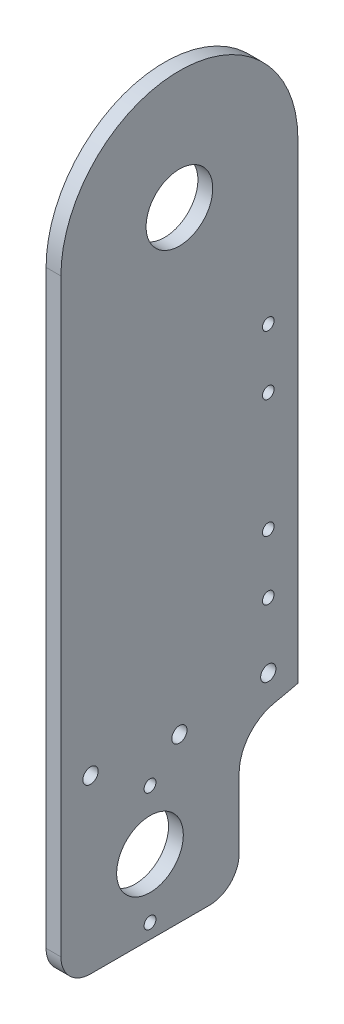
ISO-10303-21;
HEADER;
FILE_DESCRIPTION(('STEP AP214'),'2;1');
FILE_NAME('part.step','',(''),(''),'','','');
FILE_SCHEMA(('AUTOMOTIVE_DESIGN { 1 0 10303 214 1 1 1 1 }'));
ENDSEC;
DATA;
#1=APPLICATION_CONTEXT('core data for automotive mechanical design processes');
#2=APPLICATION_PROTOCOL_DEFINITION('international standard','automotive_design',2000,#1);
#3=PRODUCT_CONTEXT('',#1,'mechanical');
#4=PRODUCT('Part','Part','',(#3));
#5=PRODUCT_RELATED_PRODUCT_CATEGORY('part','',(#4));
#6=PRODUCT_DEFINITION_FORMATION('','',#4);
#7=PRODUCT_DEFINITION_CONTEXT('part definition',#1,'design');
#8=PRODUCT_DEFINITION('design','',#6,#7);
#9=PRODUCT_DEFINITION_SHAPE('','',#8);
#10=(LENGTH_UNIT() NAMED_UNIT(*) SI_UNIT(.MILLI.,.METRE.));
#11=(NAMED_UNIT(*) PLANE_ANGLE_UNIT() SI_UNIT($,.RADIAN.));
#12=(NAMED_UNIT(*) SI_UNIT($,.STERADIAN.) SOLID_ANGLE_UNIT());
#13=UNCERTAINTY_MEASURE_WITH_UNIT(LENGTH_MEASURE(1.E-05),#10,'distance_accuracy_value','');
#14=(GEOMETRIC_REPRESENTATION_CONTEXT(3) GLOBAL_UNCERTAINTY_ASSIGNED_CONTEXT((#13)) GLOBAL_UNIT_ASSIGNED_CONTEXT((#10,
#11,#12)) REPRESENTATION_CONTEXT('',''));
#15=CARTESIAN_POINT('',(0.,0.,0.));
#16=DIRECTION('',(0.,0.,1.));
#17=DIRECTION('',(1.,0.,0.));
#18=AXIS2_PLACEMENT_3D('',#15,#16,#17);
#19=CARTESIAN_POINT('',(6.35,0.,0.));
#20=DIRECTION('',(-1.,0.,0.));
#21=DIRECTION('',(0.,0.,1.));
#22=AXIS2_PLACEMENT_3D('',#19,#20,#21);
#23=PLANE('',#22);
#24=CARTESIAN_POINT('',(6.35,-138.489896777042,-38.1));
#25=DIRECTION('',(1.,0.,0.));
#26=DIRECTION('',(0.,0.,-1.));
#27=AXIS2_PLACEMENT_3D('',#24,#25,#26);
#28=CIRCLE('',#27,2.4892);
#29=CARTESIAN_POINT('',(6.35,-138.489896777042,-40.5892));
#30=VERTEX_POINT('',#29);
#31=EDGE_CURVE('E319',#30,#30,#28,.T.);
#32=ORIENTED_EDGE('',*,*,#31,.F.);
#33=EDGE_LOOP('',(#32));
#34=FACE_BOUND('',#33,.T.);
#35=CARTESIAN_POINT('',(6.35,-87.6898967770419,-38.1));
#36=DIRECTION('',(1.,0.,0.));
#37=DIRECTION('',(0.,0.,-1.));
#38=AXIS2_PLACEMENT_3D('',#35,#36,#37);
#39=CIRCLE('',#38,2.48919999999998);
#40=CARTESIAN_POINT('',(6.35,-87.6898967770419,-40.5892));
#41=VERTEX_POINT('',#40);
#42=EDGE_CURVE('E307',#41,#41,#39,.T.);
#43=ORIENTED_EDGE('',*,*,#42,.F.);
#44=EDGE_LOOP('',(#43));
#45=FACE_BOUND('',#44,.T.);
#46=CARTESIAN_POINT('',(6.35,-62.2898967770419,-38.1));
#47=DIRECTION('',(1.,0.,0.));
#48=DIRECTION('',(0.,0.,-1.));
#49=AXIS2_PLACEMENT_3D('',#46,#47,#48);
#50=CIRCLE('',#49,2.48919999999999);
#51=CARTESIAN_POINT('',(6.35,-62.2898967770419,-40.5892));
#52=VERTEX_POINT('',#51);
#53=EDGE_CURVE('E295',#52,#52,#50,.T.);
#54=ORIENTED_EDGE('',*,*,#53,.F.);
#55=EDGE_LOOP('',(#54));
#56=FACE_BOUND('',#55,.T.);
#57=CARTESIAN_POINT('',(6.35,-259.139896777041,12.6030145186586));
#58=DIRECTION('',(1.,0.,0.));
#59=DIRECTION('',(0.,0.,-1.));
#60=AXIS2_PLACEMENT_3D('',#57,#58,#59);
#61=CIRCLE('',#60,2.53999999999999);
#62=CARTESIAN_POINT('',(6.35,-259.139896777041,10.0630145186586));
#63=VERTEX_POINT('',#62);
#64=EDGE_CURVE('E287',#63,#63,#61,.T.);
#65=ORIENTED_EDGE('',*,*,#64,.F.);
#66=EDGE_LOOP('',(#65));
#67=FACE_BOUND('',#66,.T.);
#68=CARTESIAN_POINT('',(6.35,-208.339896777041,12.6030145186586));
#69=DIRECTION('',(1.,0.,0.));
#70=DIRECTION('',(0.,0.,-1.));
#71=AXIS2_PLACEMENT_3D('',#68,#69,#70);
#72=CIRCLE('',#71,2.53999999999999);
#73=CARTESIAN_POINT('',(6.35,-208.339896777041,10.0630145186586));
#74=VERTEX_POINT('',#73);
#75=EDGE_CURVE('E279',#74,#74,#72,.T.);
#76=ORIENTED_EDGE('',*,*,#75,.F.);
#77=EDGE_LOOP('',(#76));
#78=FACE_BOUND('',#77,.T.);
#79=CARTESIAN_POINT('',(6.35,-191.833069099152,-38.1000000000002));
#80=DIRECTION('',(1.,0.,0.));
#81=DIRECTION('',(0.,0.,-1.));
#82=AXIS2_PLACEMENT_3D('',#79,#80,#81);
#83=CIRCLE('',#82,3.26389999999999);
#84=CARTESIAN_POINT('',(6.35,-191.833069099152,-41.3639000000001));
#85=VERTEX_POINT('',#84);
#86=EDGE_CURVE('E271',#85,#85,#83,.T.);
#87=ORIENTED_EDGE('',*,*,#86,.F.);
#88=EDGE_LOOP('',(#87));
#89=FACE_BOUND('',#88,.T.);
#90=CARTESIAN_POINT('',(6.35,-195.58,1.36443570224712E-12));
#91=DIRECTION('',(1.,0.,0.));
#92=DIRECTION('',(0.,0.,-1.));
#93=AXIS2_PLACEMENT_3D('',#90,#91,#92);
#94=CIRCLE('',#93,3.26389999999999);
#95=CARTESIAN_POINT('',(6.35,-195.58,-3.26389999999862));
#96=VERTEX_POINT('',#95);
#97=EDGE_CURVE('E263',#96,#96,#94,.T.);
#98=ORIENTED_EDGE('',*,*,#97,.F.);
#99=EDGE_LOOP('',(#98));
#100=FACE_BOUND('',#99,.T.);
#101=CARTESIAN_POINT('',(6.35,-191.833069099151,38.1000000000027));
#102=DIRECTION('',(1.,0.,0.));
#103=DIRECTION('',(0.,0.,-1.));
#104=AXIS2_PLACEMENT_3D('',#101,#102,#103);
#105=CIRCLE('',#104,3.26389999999999);
#106=CARTESIAN_POINT('',(6.35,-191.833069099151,34.8361000000027));
#107=VERTEX_POINT('',#106);
#108=EDGE_CURVE('E255',#107,#107,#105,.T.);
#109=ORIENTED_EDGE('',*,*,#108,.F.);
#110=EDGE_LOOP('',(#109));
#111=FACE_BOUND('',#110,.T.);
#112=DIRECTION('',(0.,0.,-1.));
#113=VECTOR('',#112,1.);
#114=CARTESIAN_POINT('',(6.35,-265.489896777041,50.8000000000028));
#115=LINE('',#114,#113);
#116=CARTESIAN_POINT('',(6.35,-265.489896777041,38.1000000000034));
#117=VERTEX_POINT('',#116);
#118=CARTESIAN_POINT('',(6.35,-265.489896777041,-12.8939709626856));
#119=VERTEX_POINT('',#118);
#120=EDGE_CURVE('E128',#117,#119,#115,.T.);
#121=ORIENTED_EDGE('',*,*,#120,.T.);
#122=CARTESIAN_POINT('',(6.35,-252.789896777041,-12.8939709626856));
#123=DIRECTION('',(-1.,0.,0.));
#124=DIRECTION('',(0.,0.,1.));
#125=AXIS2_PLACEMENT_3D('',#122,#123,#124);
#126=CIRCLE('',#125,12.7);
#127=CARTESIAN_POINT('',(6.35,-252.789896777041,-25.5939709626856));
#128=VERTEX_POINT('',#127);
#129=EDGE_CURVE('E174',#119,#128,#126,.F.);
#130=ORIENTED_EDGE('',*,*,#129,.T.);
#131=DIRECTION('',(0.,1.,0.));
#132=VECTOR('',#131,1.);
#133=CARTESIAN_POINT('',(6.35,-265.489896777041,-25.5939709626856));
#134=LINE('',#133,#132);
#135=CARTESIAN_POINT('',(6.35,-222.903218363224,-25.5939709626855));
#136=VERTEX_POINT('',#135);
#137=EDGE_CURVE('E210',#128,#136,#134,.T.);
#138=ORIENTED_EDGE('',*,*,#137,.T.);
#139=CARTESIAN_POINT('',(6.35,-222.903218363224,-44.6439709626855));
#140=DIRECTION('',(-1.,0.,0.));
#141=DIRECTION('',(0.,0.,1.));
#142=AXIS2_PLACEMENT_3D('',#139,#140,#141);
#143=CIRCLE('',#142,19.05);
#144=CARTESIAN_POINT('',(6.35,-204.224177718261,-40.9028560775443));
#145=VERTEX_POINT('',#144);
#146=EDGE_CURVE('E11',#136,#145,#143,.T.);
#147=ORIENTED_EDGE('',*,*,#146,.T.);
#148=CARTESIAN_POINT('',(6.35,0.,0.));
#149=DIRECTION('',(1.,0.,0.));
#150=DIRECTION('',(0.,0.,-1.));
#151=AXIS2_PLACEMENT_3D('',#148,#149,#150);
#152=CIRCLE('',#151,208.28);
#153=CARTESIAN_POINT('',(6.35,-201.989896777042,-50.8));
#154=VERTEX_POINT('',#153);
#155=EDGE_CURVE('E191',#145,#154,#152,.T.);
#156=ORIENTED_EDGE('',*,*,#155,.T.);
#157=DIRECTION('',(0.,1.,0.));
#158=VECTOR('',#157,1.);
#159=CARTESIAN_POINT('',(6.35,0.,-50.8));
#160=LINE('',#159,#158);
#161=CARTESIAN_POINT('',(6.35,0.,-50.8));
#162=VERTEX_POINT('',#161);
#163=EDGE_CURVE('E135',#154,#162,#160,.T.);
#164=ORIENTED_EDGE('',*,*,#163,.T.);
#165=CARTESIAN_POINT('',(6.35,0.,0.));
#166=DIRECTION('',(1.,0.,0.));
#167=DIRECTION('',(0.,0.,1.));
#168=AXIS2_PLACEMENT_3D('',#165,#166,#167);
#169=CIRCLE('',#168,50.8);
#170=CARTESIAN_POINT('',(6.35,0.,50.8));
#171=VERTEX_POINT('',#170);
#172=EDGE_CURVE('E129',#162,#171,#169,.T.);
#173=ORIENTED_EDGE('',*,*,#172,.T.);
#174=DIRECTION('',(0.,-1.,0.));
#175=VECTOR('',#174,1.);
#176=CARTESIAN_POINT('',(6.35,0.,50.8));
#177=LINE('',#176,#175);
#178=CARTESIAN_POINT('',(6.35,-252.789896777042,50.8000000000071));
#179=VERTEX_POINT('',#178);
#180=EDGE_CURVE('E116',#171,#179,#177,.T.);
#181=ORIENTED_EDGE('',*,*,#180,.T.);
#182=CARTESIAN_POINT('',(6.35,-252.789896777041,38.1000000000034));
#183=DIRECTION('',(-1.,0.,0.));
#184=DIRECTION('',(0.,0.,1.));
#185=AXIS2_PLACEMENT_3D('',#182,#183,#184);
#186=CIRCLE('',#185,12.7);
#187=EDGE_CURVE('E171',#179,#117,#186,.F.);
#188=ORIENTED_EDGE('',*,*,#187,.T.);
#189=EDGE_LOOP('',(#121,#130,#138,#147,#156,#164,#173,#181,#188));
#190=FACE_BOUND('',#189,.T.);
#191=CARTESIAN_POINT('',(6.35,0.,0.));
#192=DIRECTION('',(1.,0.,0.));
#193=DIRECTION('',(0.,0.,-1.));
#194=AXIS2_PLACEMENT_3D('',#191,#192,#193);
#195=CIRCLE('',#194,14.2875);
#196=CARTESIAN_POINT('',(6.35,0.,-14.2875));
#197=VERTEX_POINT('',#196);
#198=EDGE_CURVE('E217',#197,#197,#195,.T.);
#199=ORIENTED_EDGE('',*,*,#198,.F.);
#200=EDGE_LOOP('',(#199));
#201=FACE_BOUND('',#200,.T.);
#202=CARTESIAN_POINT('',(6.35,-233.739896777041,12.6030145186586));
#203=DIRECTION('',(1.,0.,0.));
#204=DIRECTION('',(0.,0.,-1.));
#205=AXIS2_PLACEMENT_3D('',#202,#203,#204);
#206=CIRCLE('',#205,14.2875);
#207=CARTESIAN_POINT('',(6.35,-233.739896777041,-1.68448548134139));
#208=VERTEX_POINT('',#207);
#209=EDGE_CURVE('E240',#208,#208,#206,.T.);
#210=ORIENTED_EDGE('',*,*,#209,.F.);
#211=EDGE_LOOP('',(#210));
#212=FACE_BOUND('',#211,.T.);
#213=CARTESIAN_POINT('',(6.35,-163.889896777042,-38.1));
#214=DIRECTION('',(1.,0.,0.));
#215=DIRECTION('',(0.,0.,-1.));
#216=AXIS2_PLACEMENT_3D('',#213,#214,#215);
#217=CIRCLE('',#216,2.4892);
#218=CARTESIAN_POINT('',(6.35,-163.889896777042,-40.5892));
#219=VERTEX_POINT('',#218);
#220=EDGE_CURVE('E331',#219,#219,#217,.T.);
#221=ORIENTED_EDGE('',*,*,#220,.F.);
#222=EDGE_LOOP('',(#221));
#223=FACE_BOUND('',#222,.T.);
#224=ADVANCED_FACE('F44',(#34,#45,#56,#67,#78,#89,#100,#111,#190,#201,#212,#223),#23,.F.);
#225=CARTESIAN_POINT('',(0.,0.,0.));
#226=DIRECTION('',(-1.,0.,0.));
#227=DIRECTION('',(0.,0.,1.));
#228=AXIS2_PLACEMENT_3D('',#225,#226,#227);
#229=PLANE('',#228);
#230=CARTESIAN_POINT('',(0.,-163.889896777042,-38.1));
#231=DIRECTION('',(1.,0.,0.));
#232=DIRECTION('',(0.,0.,-1.));
#233=AXIS2_PLACEMENT_3D('',#230,#231,#232);
#234=CIRCLE('',#233,4.7625);
#235=CARTESIAN_POINT('',(0.,-163.889896777042,-42.8625));
#236=VERTEX_POINT('',#235);
#237=EDGE_CURVE('E335',#236,#236,#234,.T.);
#238=ORIENTED_EDGE('',*,*,#237,.T.);
#239=EDGE_LOOP('',(#238));
#240=FACE_BOUND('',#239,.T.);
#241=CARTESIAN_POINT('',(0.,-138.489896777042,-38.1));
#242=DIRECTION('',(1.,0.,0.));
#243=DIRECTION('',(0.,0.,-1.));
#244=AXIS2_PLACEMENT_3D('',#241,#242,#243);
#245=CIRCLE('',#244,4.7625);
#246=CARTESIAN_POINT('',(0.,-138.489896777042,-42.8625));
#247=VERTEX_POINT('',#246);
#248=EDGE_CURVE('E323',#247,#247,#245,.T.);
#249=ORIENTED_EDGE('',*,*,#248,.T.);
#250=EDGE_LOOP('',(#249));
#251=FACE_BOUND('',#250,.T.);
#252=CARTESIAN_POINT('',(0.,-87.6898967770419,-38.1));
#253=DIRECTION('',(1.,0.,0.));
#254=DIRECTION('',(0.,0.,-1.));
#255=AXIS2_PLACEMENT_3D('',#252,#253,#254);
#256=CIRCLE('',#255,4.7625);
#257=CARTESIAN_POINT('',(0.,-87.6898967770419,-42.8625));
#258=VERTEX_POINT('',#257);
#259=EDGE_CURVE('E311',#258,#258,#256,.T.);
#260=ORIENTED_EDGE('',*,*,#259,.T.);
#261=EDGE_LOOP('',(#260));
#262=FACE_BOUND('',#261,.T.);
#263=CARTESIAN_POINT('',(0.,-62.2898967770419,-38.1));
#264=DIRECTION('',(1.,0.,0.));
#265=DIRECTION('',(0.,0.,-1.));
#266=AXIS2_PLACEMENT_3D('',#263,#264,#265);
#267=CIRCLE('',#266,4.7625);
#268=CARTESIAN_POINT('',(0.,-62.2898967770419,-42.8625));
#269=VERTEX_POINT('',#268);
#270=EDGE_CURVE('E299',#269,#269,#267,.T.);
#271=ORIENTED_EDGE('',*,*,#270,.T.);
#272=EDGE_LOOP('',(#271));
#273=FACE_BOUND('',#272,.T.);
#274=CARTESIAN_POINT('',(0.,-259.139896777041,12.6030145186586));
#275=DIRECTION('',(1.,0.,0.));
#276=DIRECTION('',(0.,0.,-1.));
#277=AXIS2_PLACEMENT_3D('',#274,#275,#276);
#278=CIRCLE('',#277,2.53999999999999);
#279=CARTESIAN_POINT('',(0.,-259.139896777041,10.0630145186586));
#280=VERTEX_POINT('',#279);
#281=EDGE_CURVE('E283',#280,#280,#278,.T.);
#282=ORIENTED_EDGE('',*,*,#281,.T.);
#283=EDGE_LOOP('',(#282));
#284=FACE_BOUND('',#283,.T.);
#285=CARTESIAN_POINT('',(0.,-208.339896777041,12.6030145186586));
#286=DIRECTION('',(1.,0.,0.));
#287=DIRECTION('',(0.,0.,-1.));
#288=AXIS2_PLACEMENT_3D('',#285,#286,#287);
#289=CIRCLE('',#288,2.53999999999999);
#290=CARTESIAN_POINT('',(0.,-208.339896777041,10.0630145186586));
#291=VERTEX_POINT('',#290);
#292=EDGE_CURVE('E275',#291,#291,#289,.T.);
#293=ORIENTED_EDGE('',*,*,#292,.T.);
#294=EDGE_LOOP('',(#293));
#295=FACE_BOUND('',#294,.T.);
#296=CARTESIAN_POINT('',(0.,-191.833069099152,-38.1000000000002));
#297=DIRECTION('',(1.,0.,0.));
#298=DIRECTION('',(0.,0.,-1.));
#299=AXIS2_PLACEMENT_3D('',#296,#297,#298);
#300=CIRCLE('',#299,3.26389999999999);
#301=CARTESIAN_POINT('',(0.,-191.833069099152,-41.3639000000001));
#302=VERTEX_POINT('',#301);
#303=EDGE_CURVE('E267',#302,#302,#300,.T.);
#304=ORIENTED_EDGE('',*,*,#303,.T.);
#305=EDGE_LOOP('',(#304));
#306=FACE_BOUND('',#305,.T.);
#307=CARTESIAN_POINT('',(0.,-195.58,1.36443570224712E-12));
#308=DIRECTION('',(1.,0.,0.));
#309=DIRECTION('',(0.,0.,-1.));
#310=AXIS2_PLACEMENT_3D('',#307,#308,#309);
#311=CIRCLE('',#310,3.26389999999999);
#312=CARTESIAN_POINT('',(0.,-195.58,-3.26389999999862));
#313=VERTEX_POINT('',#312);
#314=EDGE_CURVE('E259',#313,#313,#311,.T.);
#315=ORIENTED_EDGE('',*,*,#314,.T.);
#316=EDGE_LOOP('',(#315));
#317=FACE_BOUND('',#316,.T.);
#318=CARTESIAN_POINT('',(0.,-191.833069099151,38.1000000000027));
#319=DIRECTION('',(1.,0.,0.));
#320=DIRECTION('',(0.,0.,-1.));
#321=AXIS2_PLACEMENT_3D('',#318,#319,#320);
#322=CIRCLE('',#321,3.26389999999999);
#323=CARTESIAN_POINT('',(0.,-191.833069099151,34.8361000000027));
#324=VERTEX_POINT('',#323);
#325=EDGE_CURVE('E248',#324,#324,#322,.T.);
#326=ORIENTED_EDGE('',*,*,#325,.T.);
#327=EDGE_LOOP('',(#326));
#328=FACE_BOUND('',#327,.T.);
#329=CARTESIAN_POINT('',(0.,0.,0.));
#330=DIRECTION('',(1.,0.,0.));
#331=DIRECTION('',(0.,0.,-1.));
#332=AXIS2_PLACEMENT_3D('',#329,#330,#331);
#333=CIRCLE('',#332,14.2875);
#334=CARTESIAN_POINT('',(0.,0.,-14.2875));
#335=VERTEX_POINT('',#334);
#336=EDGE_CURVE('E236',#335,#335,#333,.T.);
#337=ORIENTED_EDGE('',*,*,#336,.T.);
#338=EDGE_LOOP('',(#337));
#339=FACE_BOUND('',#338,.T.);
#340=DIRECTION('',(0.,1.,0.));
#341=VECTOR('',#340,1.);
#342=CARTESIAN_POINT('',(0.,-265.489896777041,-25.5939709626856));
#343=LINE('',#342,#341);
#344=CARTESIAN_POINT('',(0.,-252.789896777041,-25.5939709626856));
#345=VERTEX_POINT('',#344);
#346=CARTESIAN_POINT('',(0.,-222.903218363224,-25.5939709626855));
#347=VERTEX_POINT('',#346);
#348=EDGE_CURVE('E198',#345,#347,#343,.T.);
#349=ORIENTED_EDGE('',*,*,#348,.F.);
#350=CARTESIAN_POINT('',(0.,-252.789896777041,-12.8939709626856));
#351=DIRECTION('',(-1.,0.,0.));
#352=DIRECTION('',(0.,0.,1.));
#353=AXIS2_PLACEMENT_3D('',#350,#351,#352);
#354=CIRCLE('',#353,12.7);
#355=CARTESIAN_POINT('',(0.,-265.489896777041,-12.8939709626856));
#356=VERTEX_POINT('',#355);
#357=EDGE_CURVE('E161',#345,#356,#354,.T.);
#358=ORIENTED_EDGE('',*,*,#357,.T.);
#359=DIRECTION('',(0.,0.,-1.));
#360=VECTOR('',#359,1.);
#361=CARTESIAN_POINT('',(0.,-265.489896777041,50.8000000000028));
#362=LINE('',#361,#360);
#363=CARTESIAN_POINT('',(0.,-265.489896777041,38.1000000000034));
#364=VERTEX_POINT('',#363);
#365=EDGE_CURVE('E203',#364,#356,#362,.T.);
#366=ORIENTED_EDGE('',*,*,#365,.F.);
#367=CARTESIAN_POINT('',(0.,-252.789896777041,38.1000000000034));
#368=DIRECTION('',(-1.,0.,0.));
#369=DIRECTION('',(0.,0.,1.));
#370=AXIS2_PLACEMENT_3D('',#367,#368,#369);
#371=CIRCLE('',#370,12.7);
#372=CARTESIAN_POINT('',(0.,-252.789896777042,50.8000000000034));
#373=VERTEX_POINT('',#372);
#374=EDGE_CURVE('E152',#364,#373,#371,.T.);
#375=ORIENTED_EDGE('',*,*,#374,.T.);
#376=DIRECTION('',(0.,-1.,0.));
#377=VECTOR('',#376,1.);
#378=CARTESIAN_POINT('',(0.,-201.98989677704,50.8000000000057));
#379=LINE('',#378,#377);
#380=CARTESIAN_POINT('',(0.,0.,50.8));
#381=VERTEX_POINT('',#380);
#382=EDGE_CURVE('E216',#381,#373,#379,.T.);
#383=ORIENTED_EDGE('',*,*,#382,.F.);
#384=CARTESIAN_POINT('',(0.,0.,0.));
#385=DIRECTION('',(1.,0.,0.));
#386=DIRECTION('',(0.,0.,1.));
#387=AXIS2_PLACEMENT_3D('',#384,#385,#386);
#388=CIRCLE('',#387,50.8);
#389=CARTESIAN_POINT('',(0.,0.,-50.8));
#390=VERTEX_POINT('',#389);
#391=EDGE_CURVE('E144',#390,#381,#388,.T.);
#392=ORIENTED_EDGE('',*,*,#391,.F.);
#393=DIRECTION('',(0.,1.,0.));
#394=VECTOR('',#393,1.);
#395=CARTESIAN_POINT('',(0.,0.,-50.8));
#396=LINE('',#395,#394);
#397=CARTESIAN_POINT('',(0.,-201.989896777042,-50.8));
#398=VERTEX_POINT('',#397);
#399=EDGE_CURVE('E140',#398,#390,#396,.T.);
#400=ORIENTED_EDGE('',*,*,#399,.F.);
#401=CARTESIAN_POINT('',(0.,0.,0.));
#402=DIRECTION('',(1.,0.,0.));
#403=DIRECTION('',(0.,0.,-1.));
#404=AXIS2_PLACEMENT_3D('',#401,#402,#403);
#405=CIRCLE('',#404,208.28);
#406=CARTESIAN_POINT('',(0.,-204.224177718261,-40.9028560775443));
#407=VERTEX_POINT('',#406);
#408=EDGE_CURVE('E190',#407,#398,#405,.T.);
#409=ORIENTED_EDGE('',*,*,#408,.F.);
#410=CARTESIAN_POINT('',(0.,-222.903218363224,-44.6439709626855));
#411=DIRECTION('',(-1.,0.,0.));
#412=DIRECTION('',(0.,0.,1.));
#413=AXIS2_PLACEMENT_3D('',#410,#411,#412);
#414=CIRCLE('',#413,19.05);
#415=EDGE_CURVE('E53',#407,#347,#414,.F.);
#416=ORIENTED_EDGE('',*,*,#415,.T.);
#417=EDGE_LOOP('',(#349,#358,#366,#375,#383,#392,#400,#409,#416));
#418=FACE_BOUND('',#417,.T.);
#419=CARTESIAN_POINT('',(0.,-233.739896777041,12.6030145186586));
#420=DIRECTION('',(1.,0.,0.));
#421=DIRECTION('',(0.,0.,-1.));
#422=AXIS2_PLACEMENT_3D('',#419,#420,#421);
#423=CIRCLE('',#422,14.2875);
#424=CARTESIAN_POINT('',(0.,-233.739896777041,-1.68448548134139));
#425=VERTEX_POINT('',#424);
#426=EDGE_CURVE('E244',#425,#425,#423,.T.);
#427=ORIENTED_EDGE('',*,*,#426,.T.);
#428=EDGE_LOOP('',(#427));
#429=FACE_BOUND('',#428,.T.);
#430=ADVANCED_FACE('F195',(#240,#251,#262,#273,#284,#295,#306,#317,#328,#339,#418,#429),#229,.T.);
#431=CARTESIAN_POINT('',(6.35,0.,0.));
#432=DIRECTION('',(-1.,0.,0.));
#433=DIRECTION('',(0.,0.,1.));
#434=AXIS2_PLACEMENT_3D('',#431,#432,#433);
#435=CYLINDRICAL_SURFACE('',#434,50.8);
#436=ORIENTED_EDGE('',*,*,#391,.T.);
#437=DIRECTION('',(-1.,0.,0.));
#438=VECTOR('',#437,1.);
#439=CARTESIAN_POINT('',(6.35,0.,50.8));
#440=LINE('',#439,#438);
#441=EDGE_CURVE('E121',#171,#381,#440,.T.);
#442=ORIENTED_EDGE('',*,*,#441,.F.);
#443=ORIENTED_EDGE('',*,*,#172,.F.);
#444=DIRECTION('',(-1.,0.,0.));
#445=VECTOR('',#444,1.);
#446=CARTESIAN_POINT('',(6.35,0.,-50.8));
#447=LINE('',#446,#445);
#448=EDGE_CURVE('E155',#162,#390,#447,.T.);
#449=ORIENTED_EDGE('',*,*,#448,.T.);
#450=EDGE_LOOP('',(#436,#442,#443,#449));
#451=FACE_BOUND('',#450,.T.);
#452=ADVANCED_FACE('F142',(#451),#435,.T.);
#453=CARTESIAN_POINT('',(6.35,-201.98989677704,50.8000000000057));
#454=DIRECTION('',(0.,0.,-1.));
#455=DIRECTION('',(0.,1.,0.));
#456=AXIS2_PLACEMENT_3D('',#453,#454,#455);
#457=PLANE('',#456);
#458=ORIENTED_EDGE('',*,*,#382,.T.);
#459=DIRECTION('',(-1.,0.,0.));
#460=VECTOR('',#459,1.);
#461=CARTESIAN_POINT('',(6.35,-252.789896777042,50.8000000000034));
#462=LINE('',#461,#460);
#463=EDGE_CURVE('E124',#373,#179,#462,.F.);
#464=ORIENTED_EDGE('',*,*,#463,.T.);
#465=ORIENTED_EDGE('',*,*,#180,.F.);
#466=ORIENTED_EDGE('',*,*,#441,.T.);
#467=EDGE_LOOP('',(#458,#464,#465,#466));
#468=FACE_BOUND('',#467,.T.);
#469=ADVANCED_FACE('F119',(#468),#457,.F.);
#470=CARTESIAN_POINT('',(6.35,-265.489896777041,50.8000000000028));
#471=DIRECTION('',(0.,1.,0.));
#472=DIRECTION('',(0.,0.,1.));
#473=AXIS2_PLACEMENT_3D('',#470,#471,#472);
#474=PLANE('',#473);
#475=ORIENTED_EDGE('',*,*,#365,.T.);
#476=DIRECTION('',(-1.,0.,0.));
#477=VECTOR('',#476,1.);
#478=CARTESIAN_POINT('',(6.35,-265.489896777041,-12.8939709626856));
#479=LINE('',#478,#477);
#480=EDGE_CURVE('E168',#356,#119,#479,.F.);
#481=ORIENTED_EDGE('',*,*,#480,.T.);
#482=ORIENTED_EDGE('',*,*,#120,.F.);
#483=DIRECTION('',(-1.,0.,0.));
#484=VECTOR('',#483,1.);
#485=CARTESIAN_POINT('',(6.35,-265.489896777041,38.1000000000034));
#486=LINE('',#485,#484);
#487=EDGE_CURVE('E164',#117,#364,#486,.T.);
#488=ORIENTED_EDGE('',*,*,#487,.T.);
#489=EDGE_LOOP('',(#475,#481,#482,#488));
#490=FACE_BOUND('',#489,.T.);
#491=ADVANCED_FACE('F224',(#490),#474,.F.);
#492=CARTESIAN_POINT('',(6.35,-265.489896777041,-25.5939709626856));
#493=DIRECTION('',(0.,0.,1.));
#494=DIRECTION('',(0.,-1.,0.));
#495=AXIS2_PLACEMENT_3D('',#492,#493,#494);
#496=PLANE('',#495);
#497=ORIENTED_EDGE('',*,*,#348,.T.);
#498=DIRECTION('',(1.,0.,0.));
#499=VECTOR('',#498,1.);
#500=CARTESIAN_POINT('',(6.35,-222.903218363224,-25.5939709626855));
#501=LINE('',#500,#499);
#502=EDGE_CURVE('E66',#347,#136,#501,.T.);
#503=ORIENTED_EDGE('',*,*,#502,.T.);
#504=ORIENTED_EDGE('',*,*,#137,.F.);
#505=DIRECTION('',(-1.,0.,0.));
#506=VECTOR('',#505,1.);
#507=CARTESIAN_POINT('',(6.35,-252.789896777041,-25.5939709626856));
#508=LINE('',#507,#506);
#509=EDGE_CURVE('E146',#128,#345,#508,.T.);
#510=ORIENTED_EDGE('',*,*,#509,.T.);
#511=EDGE_LOOP('',(#497,#503,#504,#510));
#512=FACE_BOUND('',#511,.T.);
#513=ADVANCED_FACE('F231',(#512),#496,.F.);
#514=CARTESIAN_POINT('',(6.35,0.,0.));
#515=DIRECTION('',(-1.,0.,0.));
#516=DIRECTION('',(0.,0.,1.));
#517=AXIS2_PLACEMENT_3D('',#514,#515,#516);
#518=CYLINDRICAL_SURFACE('',#517,208.28);
#519=ORIENTED_EDGE('',*,*,#155,.F.);
#520=DIRECTION('',(-1.,0.,0.));
#521=VECTOR('',#520,1.);
#522=CARTESIAN_POINT('',(6.35,-204.224177718261,-40.9028560775443));
#523=LINE('',#522,#521);
#524=EDGE_CURVE('E179',#145,#407,#523,.T.);
#525=ORIENTED_EDGE('',*,*,#524,.T.);
#526=ORIENTED_EDGE('',*,*,#408,.T.);
#527=DIRECTION('',(-1.,0.,0.));
#528=VECTOR('',#527,1.);
#529=CARTESIAN_POINT('',(6.35,-201.989896777042,-50.8));
#530=LINE('',#529,#528);
#531=EDGE_CURVE('E147',#154,#398,#530,.T.);
#532=ORIENTED_EDGE('',*,*,#531,.F.);
#533=EDGE_LOOP('',(#519,#525,#526,#532));
#534=FACE_BOUND('',#533,.T.);
#535=ADVANCED_FACE('F188',(#534),#518,.T.);
#536=CARTESIAN_POINT('',(6.35,0.,-50.8));
#537=DIRECTION('',(0.,0.,1.));
#538=DIRECTION('',(0.,-1.,0.));
#539=AXIS2_PLACEMENT_3D('',#536,#537,#538);
#540=PLANE('',#539);
#541=ORIENTED_EDGE('',*,*,#399,.T.);
#542=ORIENTED_EDGE('',*,*,#448,.F.);
#543=ORIENTED_EDGE('',*,*,#163,.F.);
#544=ORIENTED_EDGE('',*,*,#531,.T.);
#545=EDGE_LOOP('',(#541,#542,#543,#544));
#546=FACE_BOUND('',#545,.T.);
#547=ADVANCED_FACE('F369',(#546),#540,.F.);
#548=CARTESIAN_POINT('',(6.35,0.,0.));
#549=DIRECTION('',(-1.,0.,0.));
#550=DIRECTION('',(0.,0.,1.));
#551=AXIS2_PLACEMENT_3D('',#548,#549,#550);
#552=CYLINDRICAL_SURFACE('',#551,14.2875);
#553=ORIENTED_EDGE('',*,*,#198,.T.);
#554=EDGE_LOOP('',(#553));
#555=FACE_BOUND('',#554,.T.);
#556=ORIENTED_EDGE('',*,*,#336,.F.);
#557=EDGE_LOOP('',(#556));
#558=FACE_BOUND('',#557,.T.);
#559=ADVANCED_FACE('F366',(#555,#558),#552,.F.);
#560=CARTESIAN_POINT('',(6.35,-233.739896777041,12.6030145186586));
#561=DIRECTION('',(-1.,0.,0.));
#562=DIRECTION('',(0.,0.,1.));
#563=AXIS2_PLACEMENT_3D('',#560,#561,#562);
#564=CYLINDRICAL_SURFACE('',#563,14.2875);
#565=ORIENTED_EDGE('',*,*,#209,.T.);
#566=EDGE_LOOP('',(#565));
#567=FACE_BOUND('',#566,.T.);
#568=ORIENTED_EDGE('',*,*,#426,.F.);
#569=EDGE_LOOP('',(#568));
#570=FACE_BOUND('',#569,.T.);
#571=ADVANCED_FACE('F424',(#567,#570),#564,.F.);
#572=CARTESIAN_POINT('',(6.35,-191.833069099151,38.1000000000027));
#573=DIRECTION('',(1.,0.,0.));
#574=DIRECTION('',(0.,0.,-1.));
#575=AXIS2_PLACEMENT_3D('',#572,#573,#574);
#576=CYLINDRICAL_SURFACE('',#575,3.26389999999999);
#577=ORIENTED_EDGE('',*,*,#325,.F.);
#578=EDGE_LOOP('',(#577));
#579=FACE_BOUND('',#578,.T.);
#580=ORIENTED_EDGE('',*,*,#108,.T.);
#581=EDGE_LOOP('',(#580));
#582=FACE_BOUND('',#581,.T.);
#583=ADVANCED_FACE('F421',(#579,#582),#576,.F.);
#584=CARTESIAN_POINT('',(6.35,-195.58,1.36443570224712E-12));
#585=DIRECTION('',(1.,0.,0.));
#586=DIRECTION('',(0.,0.,-1.));
#587=AXIS2_PLACEMENT_3D('',#584,#585,#586);
#588=CYLINDRICAL_SURFACE('',#587,3.26389999999999);
#589=ORIENTED_EDGE('',*,*,#314,.F.);
#590=EDGE_LOOP('',(#589));
#591=FACE_BOUND('',#590,.T.);
#592=ORIENTED_EDGE('',*,*,#97,.T.);
#593=EDGE_LOOP('',(#592));
#594=FACE_BOUND('',#593,.T.);
#595=ADVANCED_FACE('F417',(#591,#594),#588,.F.);
#596=CARTESIAN_POINT('',(6.35,-191.833069099152,-38.1000000000002));
#597=DIRECTION('',(1.,0.,0.));
#598=DIRECTION('',(0.,0.,-1.));
#599=AXIS2_PLACEMENT_3D('',#596,#597,#598);
#600=CYLINDRICAL_SURFACE('',#599,3.26389999999999);
#601=ORIENTED_EDGE('',*,*,#303,.F.);
#602=EDGE_LOOP('',(#601));
#603=FACE_BOUND('',#602,.T.);
#604=ORIENTED_EDGE('',*,*,#86,.T.);
#605=EDGE_LOOP('',(#604));
#606=FACE_BOUND('',#605,.T.);
#607=ADVANCED_FACE('F413',(#603,#606),#600,.F.);
#608=CARTESIAN_POINT('',(6.35,-208.339896777041,12.6030145186586));
#609=DIRECTION('',(1.,0.,0.));
#610=DIRECTION('',(0.,0.,-1.));
#611=AXIS2_PLACEMENT_3D('',#608,#609,#610);
#612=CYLINDRICAL_SURFACE('',#611,2.53999999999999);
#613=ORIENTED_EDGE('',*,*,#292,.F.);
#614=EDGE_LOOP('',(#613));
#615=FACE_BOUND('',#614,.T.);
#616=ORIENTED_EDGE('',*,*,#75,.T.);
#617=EDGE_LOOP('',(#616));
#618=FACE_BOUND('',#617,.T.);
#619=ADVANCED_FACE('F409',(#615,#618),#612,.F.);
#620=CARTESIAN_POINT('',(6.35,-259.139896777041,12.6030145186586));
#621=DIRECTION('',(1.,0.,0.));
#622=DIRECTION('',(0.,0.,-1.));
#623=AXIS2_PLACEMENT_3D('',#620,#621,#622);
#624=CYLINDRICAL_SURFACE('',#623,2.53999999999999);
#625=ORIENTED_EDGE('',*,*,#281,.F.);
#626=EDGE_LOOP('',(#625));
#627=FACE_BOUND('',#626,.T.);
#628=ORIENTED_EDGE('',*,*,#64,.T.);
#629=EDGE_LOOP('',(#628));
#630=FACE_BOUND('',#629,.T.);
#631=ADVANCED_FACE('F385',(#627,#630),#624,.F.);
#632=CARTESIAN_POINT('',(6.35,-252.789896777041,-12.8939709626856));
#633=DIRECTION('',(-1.,0.,0.));
#634=DIRECTION('',(0.,0.,1.));
#635=AXIS2_PLACEMENT_3D('',#632,#633,#634);
#636=CYLINDRICAL_SURFACE('',#635,12.7);
#637=ORIENTED_EDGE('',*,*,#129,.F.);
#638=ORIENTED_EDGE('',*,*,#480,.F.);
#639=ORIENTED_EDGE('',*,*,#357,.F.);
#640=ORIENTED_EDGE('',*,*,#509,.F.);
#641=EDGE_LOOP('',(#637,#638,#639,#640));
#642=FACE_BOUND('',#641,.T.);
#643=ADVANCED_FACE('F229',(#642),#636,.T.);
#644=CARTESIAN_POINT('',(6.35,-252.789896777041,38.1000000000034));
#645=DIRECTION('',(-1.,0.,0.));
#646=DIRECTION('',(0.,0.,1.));
#647=AXIS2_PLACEMENT_3D('',#644,#645,#646);
#648=CYLINDRICAL_SURFACE('',#647,12.7);
#649=ORIENTED_EDGE('',*,*,#187,.F.);
#650=ORIENTED_EDGE('',*,*,#463,.F.);
#651=ORIENTED_EDGE('',*,*,#374,.F.);
#652=ORIENTED_EDGE('',*,*,#487,.F.);
#653=EDGE_LOOP('',(#649,#650,#651,#652));
#654=FACE_BOUND('',#653,.T.);
#655=ADVANCED_FACE('F384',(#654),#648,.T.);
#656=CARTESIAN_POINT('',(6.35,-222.903218363224,-44.6439709626855));
#657=DIRECTION('',(-1.,0.,0.));
#658=DIRECTION('',(0.,0.,1.));
#659=AXIS2_PLACEMENT_3D('',#656,#657,#658);
#660=CYLINDRICAL_SURFACE('',#659,19.05);
#661=ORIENTED_EDGE('',*,*,#146,.F.);
#662=ORIENTED_EDGE('',*,*,#502,.F.);
#663=ORIENTED_EDGE('',*,*,#415,.F.);
#664=ORIENTED_EDGE('',*,*,#524,.F.);
#665=EDGE_LOOP('',(#661,#662,#663,#664));
#666=FACE_BOUND('',#665,.T.);
#667=ADVANCED_FACE('F46',(#666),#660,.F.);
#668=CARTESIAN_POINT('',(2.2733,-62.2898967770419,-38.1));
#669=DIRECTION('',(-1.,0.,0.));
#670=DIRECTION('',(0.,0.,1.));
#671=AXIS2_PLACEMENT_3D('',#668,#669,#670);
#672=CONICAL_SURFACE('',#671,2.4892,0.785398163397448);
#673=ORIENTED_EDGE('',*,*,#270,.F.);
#674=EDGE_LOOP('',(#673));
#675=FACE_BOUND('',#674,.T.);
#676=CARTESIAN_POINT('',(2.2733,-62.2898967770419,-38.1));
#677=DIRECTION('',(1.,0.,0.));
#678=DIRECTION('',(0.,0.,-1.));
#679=AXIS2_PLACEMENT_3D('',#676,#677,#678);
#680=CIRCLE('',#679,2.4892);
#681=CARTESIAN_POINT('',(2.2733,-62.2898967770419,-40.5892));
#682=VERTEX_POINT('',#681);
#683=EDGE_CURVE('E291',#682,#682,#680,.T.);
#684=ORIENTED_EDGE('',*,*,#683,.T.);
#685=EDGE_LOOP('',(#684));
#686=FACE_BOUND('',#685,.T.);
#687=ADVANCED_FACE('F390',(#675,#686),#672,.F.);
#688=CARTESIAN_POINT('',(6.35,-62.2898967770419,-38.1));
#689=DIRECTION('',(1.,0.,0.));
#690=DIRECTION('',(0.,0.,-1.));
#691=AXIS2_PLACEMENT_3D('',#688,#689,#690);
#692=CYLINDRICAL_SURFACE('',#691,2.48919999999999);
#693=ORIENTED_EDGE('',*,*,#683,.F.);
#694=EDGE_LOOP('',(#693));
#695=FACE_BOUND('',#694,.T.);
#696=ORIENTED_EDGE('',*,*,#53,.T.);
#697=EDGE_LOOP('',(#696));
#698=FACE_BOUND('',#697,.T.);
#699=ADVANCED_FACE('F394',(#695,#698),#692,.F.);
#700=CARTESIAN_POINT('',(2.2733,-87.6898967770419,-38.1));
#701=DIRECTION('',(-1.,0.,0.));
#702=DIRECTION('',(0.,0.,1.));
#703=AXIS2_PLACEMENT_3D('',#700,#701,#702);
#704=CONICAL_SURFACE('',#703,2.4892,0.78539816339745);
#705=ORIENTED_EDGE('',*,*,#259,.F.);
#706=EDGE_LOOP('',(#705));
#707=FACE_BOUND('',#706,.T.);
#708=CARTESIAN_POINT('',(2.2733,-87.6898967770419,-38.1));
#709=DIRECTION('',(1.,0.,0.));
#710=DIRECTION('',(0.,0.,-1.));
#711=AXIS2_PLACEMENT_3D('',#708,#709,#710);
#712=CIRCLE('',#711,2.4892);
#713=CARTESIAN_POINT('',(2.2733,-87.6898967770419,-40.5892));
#714=VERTEX_POINT('',#713);
#715=EDGE_CURVE('E303',#714,#714,#712,.T.);
#716=ORIENTED_EDGE('',*,*,#715,.T.);
#717=EDGE_LOOP('',(#716));
#718=FACE_BOUND('',#717,.T.);
#719=ADVANCED_FACE('F400',(#707,#718),#704,.F.);
#720=CARTESIAN_POINT('',(6.35,-87.6898967770419,-38.1));
#721=DIRECTION('',(1.,0.,0.));
#722=DIRECTION('',(0.,0.,-1.));
#723=AXIS2_PLACEMENT_3D('',#720,#721,#722);
#724=CYLINDRICAL_SURFACE('',#723,2.48919999999999);
#725=ORIENTED_EDGE('',*,*,#715,.F.);
#726=EDGE_LOOP('',(#725));
#727=FACE_BOUND('',#726,.T.);
#728=ORIENTED_EDGE('',*,*,#42,.T.);
#729=EDGE_LOOP('',(#728));
#730=FACE_BOUND('',#729,.T.);
#731=ADVANCED_FACE('F549',(#727,#730),#724,.F.);
#732=CARTESIAN_POINT('',(2.2733,-138.489896777042,-38.1));
#733=DIRECTION('',(-1.,0.,0.));
#734=DIRECTION('',(0.,0.,1.));
#735=AXIS2_PLACEMENT_3D('',#732,#733,#734);
#736=CONICAL_SURFACE('',#735,2.4892,0.78539816339745);
#737=ORIENTED_EDGE('',*,*,#248,.F.);
#738=EDGE_LOOP('',(#737));
#739=FACE_BOUND('',#738,.T.);
#740=CARTESIAN_POINT('',(2.2733,-138.489896777042,-38.1));
#741=DIRECTION('',(1.,0.,0.));
#742=DIRECTION('',(0.,0.,-1.));
#743=AXIS2_PLACEMENT_3D('',#740,#741,#742);
#744=CIRCLE('',#743,2.4892);
#745=CARTESIAN_POINT('',(2.2733,-138.489896777042,-40.5892));
#746=VERTEX_POINT('',#745);
#747=EDGE_CURVE('E315',#746,#746,#744,.T.);
#748=ORIENTED_EDGE('',*,*,#747,.T.);
#749=EDGE_LOOP('',(#748));
#750=FACE_BOUND('',#749,.T.);
#751=ADVANCED_FACE('F557',(#739,#750),#736,.F.);
#752=CARTESIAN_POINT('',(6.35,-138.489896777042,-38.1));
#753=DIRECTION('',(1.,0.,0.));
#754=DIRECTION('',(0.,0.,-1.));
#755=AXIS2_PLACEMENT_3D('',#752,#753,#754);
#756=CYLINDRICAL_SURFACE('',#755,2.4892);
#757=ORIENTED_EDGE('',*,*,#747,.F.);
#758=EDGE_LOOP('',(#757));
#759=FACE_BOUND('',#758,.T.);
#760=ORIENTED_EDGE('',*,*,#31,.T.);
#761=EDGE_LOOP('',(#760));
#762=FACE_BOUND('',#761,.T.);
#763=ADVANCED_FACE('F346',(#759,#762),#756,.F.);
#764=CARTESIAN_POINT('',(2.2733,-163.889896777042,-38.1));
#765=DIRECTION('',(-1.,0.,0.));
#766=DIRECTION('',(0.,0.,1.));
#767=AXIS2_PLACEMENT_3D('',#764,#765,#766);
#768=CONICAL_SURFACE('',#767,2.4892,0.78539816339745);
#769=ORIENTED_EDGE('',*,*,#237,.F.);
#770=EDGE_LOOP('',(#769));
#771=FACE_BOUND('',#770,.T.);
#772=CARTESIAN_POINT('',(2.2733,-163.889896777042,-38.1));
#773=DIRECTION('',(1.,0.,0.));
#774=DIRECTION('',(0.,0.,-1.));
#775=AXIS2_PLACEMENT_3D('',#772,#773,#774);
#776=CIRCLE('',#775,2.4892);
#777=CARTESIAN_POINT('',(2.2733,-163.889896777042,-40.5892));
#778=VERTEX_POINT('',#777);
#779=EDGE_CURVE('E327',#778,#778,#776,.T.);
#780=ORIENTED_EDGE('',*,*,#779,.T.);
#781=EDGE_LOOP('',(#780));
#782=FACE_BOUND('',#781,.T.);
#783=ADVANCED_FACE('F342',(#771,#782),#768,.F.);
#784=CARTESIAN_POINT('',(6.35,-163.889896777042,-38.1));
#785=DIRECTION('',(1.,0.,0.));
#786=DIRECTION('',(0.,0.,-1.));
#787=AXIS2_PLACEMENT_3D('',#784,#785,#786);
#788=CYLINDRICAL_SURFACE('',#787,2.4892);
#789=ORIENTED_EDGE('',*,*,#779,.F.);
#790=EDGE_LOOP('',(#789));
#791=FACE_BOUND('',#790,.T.);
#792=ORIENTED_EDGE('',*,*,#220,.T.);
#793=EDGE_LOOP('',(#792));
#794=FACE_BOUND('',#793,.T.);
#795=ADVANCED_FACE('F345',(#791,#794),#788,.F.);
#796=CLOSED_SHELL('',(#224,#430,#452,#469,#491,#513,#535,#547,#559,#571,#583,#595,#607,#619,
#631,#643,#655,#667,#687,#699,#719,#731,#751,#763,#783,#795));
#797=MANIFOLD_SOLID_BREP('B2',#796);
#798=ADVANCED_BREP_SHAPE_REPRESENTATION('',(#18,#797),#14);
#799=SHAPE_DEFINITION_REPRESENTATION(#9,#798);
ENDSEC;
END-ISO-10303-21;
